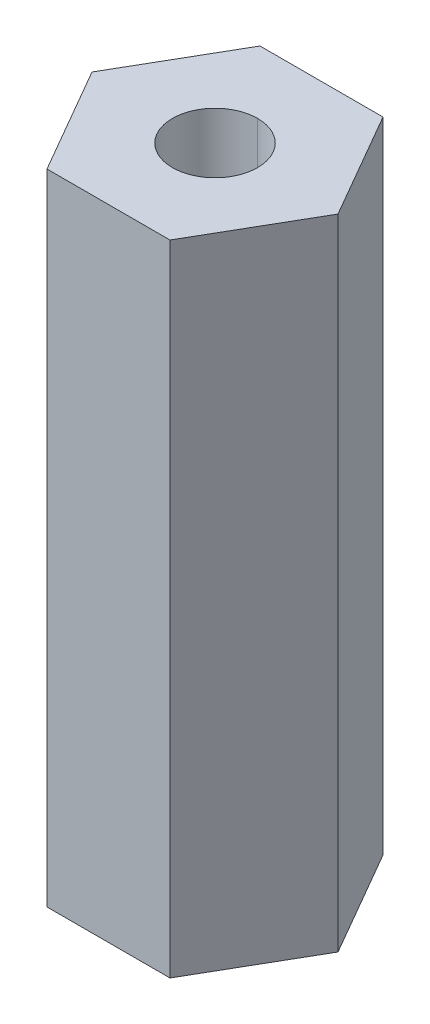
ISO-10303-21;
HEADER;
FILE_DESCRIPTION(('STEP AP214'),'2;1');
FILE_NAME('part.step','',(''),(''),'','','');
FILE_SCHEMA(('AUTOMOTIVE_DESIGN { 1 0 10303 214 1 1 1 1 }'));
ENDSEC;
DATA;
#1=APPLICATION_CONTEXT('core data for automotive mechanical design processes');
#2=APPLICATION_PROTOCOL_DEFINITION('international standard','automotive_design',2000,#1);
#3=PRODUCT_CONTEXT('',#1,'mechanical');
#4=PRODUCT('Part','Part','',(#3));
#5=PRODUCT_RELATED_PRODUCT_CATEGORY('part','',(#4));
#6=PRODUCT_DEFINITION_FORMATION('','',#4);
#7=PRODUCT_DEFINITION_CONTEXT('part definition',#1,'design');
#8=PRODUCT_DEFINITION('design','',#6,#7);
#9=PRODUCT_DEFINITION_SHAPE('','',#8);
#10=(LENGTH_UNIT() NAMED_UNIT(*) SI_UNIT(.MILLI.,.METRE.));
#11=(NAMED_UNIT(*) PLANE_ANGLE_UNIT() SI_UNIT($,.RADIAN.));
#12=(NAMED_UNIT(*) SI_UNIT($,.STERADIAN.) SOLID_ANGLE_UNIT());
#13=UNCERTAINTY_MEASURE_WITH_UNIT(LENGTH_MEASURE(1.E-05),#10,'distance_accuracy_value','');
#14=(GEOMETRIC_REPRESENTATION_CONTEXT(3) GLOBAL_UNCERTAINTY_ASSIGNED_CONTEXT((#13)) GLOBAL_UNIT_ASSIGNED_CONTEXT((#10,
#11,#12)) REPRESENTATION_CONTEXT('',''));
#15=CARTESIAN_POINT('',(0.,0.,0.));
#16=DIRECTION('',(0.,0.,1.));
#17=DIRECTION('',(1.,0.,0.));
#18=AXIS2_PLACEMENT_3D('',#15,#16,#17);
#19=CARTESIAN_POINT('',(0.,15.,1.));
#20=CARTESIAN_POINT('',(-1.,15.,1.));
#21=CARTESIAN_POINT('',(-1.,15.,0.));
#22=CARTESIAN_POINT('',(-1.,15.,-1.));
#23=CARTESIAN_POINT('',(0.,15.,-1.));
#24=CARTESIAN_POINT('',(0.,0.,1.));
#25=CARTESIAN_POINT('',(-1.,0.,1.));
#26=CARTESIAN_POINT('',(-1.,0.,0.));
#27=CARTESIAN_POINT('',(-1.,0.,-1.));
#28=CARTESIAN_POINT('',(0.,0.,-1.));
#29=(BOUNDED_SURFACE() B_SPLINE_SURFACE(1,2,((#19,#20,#21,#22,#23),(#24,#25,#26,#27,#28)),
.UNSPECIFIED.,.F.,.F.,.F.) B_SPLINE_SURFACE_WITH_KNOTS((2,2),(3,2,3),(-7.5,7.5),
(-3.14159265358979,-1.5707963267949,0.),
.UNSPECIFIED.) GEOMETRIC_REPRESENTATION_ITEM() RATIONAL_B_SPLINE_SURFACE(((1.,0.707106781186548,
1.,0.707106781186548,1.),(1.,0.707106781186548,1.,0.707106781186548,1.))) REPRESENTATION_ITEM('') SURFACE());
#30=CARTESIAN_POINT('',(0.,15.,-1.));
#31=CARTESIAN_POINT('',(0.,0.,-1.));
#32=(BOUNDED_CURVE() B_SPLINE_CURVE(1,(#30,#31),.UNSPECIFIED.,.F.,
.F.) B_SPLINE_CURVE_WITH_KNOTS((2,2),(-7.5,7.5),
.UNSPECIFIED.) CURVE() GEOMETRIC_REPRESENTATION_ITEM() RATIONAL_B_SPLINE_CURVE((1.,1.)) REPRESENTATION_ITEM(''));
#33=CARTESIAN_POINT('',(0.,15.,-1.));
#34=VERTEX_POINT('',#33);
#35=CARTESIAN_POINT('',(0.,0.,-1.));
#36=VERTEX_POINT('',#35);
#37=EDGE_CURVE('E174',#34,#36,#32,.T.);
#38=CARTESIAN_POINT('',(0.,15.,1.));
#39=CARTESIAN_POINT('',(-1.,15.,1.));
#40=CARTESIAN_POINT('',(-1.,15.,0.));
#41=CARTESIAN_POINT('',(-1.,15.,-1.));
#42=CARTESIAN_POINT('',(0.,15.,-1.));
#43=(BOUNDED_CURVE() B_SPLINE_CURVE(2,(#38,#39,#40,#41,#42),.UNSPECIFIED.,.F.,
.F.) B_SPLINE_CURVE_WITH_KNOTS((3,2,3),(0.,1.5707963267949,3.14159265358979),
.UNSPECIFIED.) CURVE() GEOMETRIC_REPRESENTATION_ITEM() RATIONAL_B_SPLINE_CURVE((1.,
0.707106781186548,1.,0.707106781186548,1.)) REPRESENTATION_ITEM(''));
#44=CARTESIAN_POINT('',(0.,15.,1.));
#45=VERTEX_POINT('',#44);
#46=EDGE_CURVE('E91',#45,#34,#43,.T.);
#47=CARTESIAN_POINT('',(0.,15.,1.));
#48=CARTESIAN_POINT('',(0.,0.,1.));
#49=(BOUNDED_CURVE() B_SPLINE_CURVE(1,(#47,#48),.UNSPECIFIED.,.F.,
.F.) B_SPLINE_CURVE_WITH_KNOTS((2,2),(-7.5,7.5),
.UNSPECIFIED.) CURVE() GEOMETRIC_REPRESENTATION_ITEM() RATIONAL_B_SPLINE_CURVE((1.,1.)) REPRESENTATION_ITEM(''));
#50=CARTESIAN_POINT('',(0.,0.,1.));
#51=VERTEX_POINT('',#50);
#52=EDGE_CURVE('E23',#45,#51,#49,.T.);
#53=CARTESIAN_POINT('',(0.,0.,1.));
#54=CARTESIAN_POINT('',(-1.,0.,1.));
#55=CARTESIAN_POINT('',(-1.,0.,0.));
#56=CARTESIAN_POINT('',(-1.,0.,-1.));
#57=CARTESIAN_POINT('',(0.,0.,-1.));
#58=(BOUNDED_CURVE() B_SPLINE_CURVE(2,(#53,#54,#55,#56,#57),.UNSPECIFIED.,.F.,
.F.) B_SPLINE_CURVE_WITH_KNOTS((3,2,3),(0.,1.5707963267949,3.14159265358979),
.UNSPECIFIED.) CURVE() GEOMETRIC_REPRESENTATION_ITEM() RATIONAL_B_SPLINE_CURVE((1.,
0.707106781186548,1.,0.707106781186548,1.)) REPRESENTATION_ITEM(''));
#59=EDGE_CURVE('E79',#51,#36,#58,.T.);
#60=ORIENTED_EDGE('',*,*,#37,.F.);
#61=ORIENTED_EDGE('',*,*,#46,.F.);
#62=ORIENTED_EDGE('',*,*,#52,.T.);
#63=ORIENTED_EDGE('',*,*,#59,.T.);
#64=EDGE_LOOP('',(#60,#61,#62,#63));
#65=FACE_BOUND('',#64,.T.);
#66=ADVANCED_FACE('F17',(#65),#29,.T.);
#67=CARTESIAN_POINT('',(1.43837567300093,-0.0099999999999989,2.50866025403838));
#68=CARTESIAN_POINT('',(1.43837567300093,15.01,2.50866025403838));
#69=CARTESIAN_POINT('',(2.89175134571016,-0.0099999999999989,-0.00866025420518224));
#70=CARTESIAN_POINT('',(2.89175134571016,15.01,-0.00866025420518224));
#71=(BOUNDED_SURFACE() B_SPLINE_SURFACE(1,1,((#67,#68),(#69,#70)),.UNSPECIFIED.,.F.,.F.,
.F.) B_SPLINE_SURFACE_WITH_KNOTS((2,2),(2,2),(-0.28967513459611,0.001),(-1.501,0.001),
.UNSPECIFIED.) GEOMETRIC_REPRESENTATION_ITEM() RATIONAL_B_SPLINE_SURFACE(((1.,1.),(1.,1.))) REPRESENTATION_ITEM('') SURFACE());
#72=CARTESIAN_POINT('',(1.443375673,0.,2.5));
#73=CARTESIAN_POINT('',(2.886751346,0.,0.));
#74=(BOUNDED_CURVE() B_SPLINE_CURVE(1,(#72,#73),.UNSPECIFIED.,.F.,
.F.) B_SPLINE_CURVE_WITH_KNOTS((2,2),(0.,1.),
.UNSPECIFIED.) CURVE() GEOMETRIC_REPRESENTATION_ITEM() RATIONAL_B_SPLINE_CURVE((1.,1.)) REPRESENTATION_ITEM(''));
#75=CARTESIAN_POINT('',(1.443375673,0.,2.5));
#76=VERTEX_POINT('',#75);
#77=CARTESIAN_POINT('',(2.886751346,0.,0.));
#78=VERTEX_POINT('',#77);
#79=EDGE_CURVE('E123',#76,#78,#74,.T.);
#80=CARTESIAN_POINT('',(2.886751346,15.,0.));
#81=CARTESIAN_POINT('',(2.886751346,0.,0.));
#82=(BOUNDED_CURVE() B_SPLINE_CURVE(1,(#80,#81),.UNSPECIFIED.,.F.,
.F.) B_SPLINE_CURVE_WITH_KNOTS((2,2),(0.,1.),
.UNSPECIFIED.) CURVE() GEOMETRIC_REPRESENTATION_ITEM() RATIONAL_B_SPLINE_CURVE((1.,1.)) REPRESENTATION_ITEM(''));
#83=CARTESIAN_POINT('',(2.886751346,15.,0.));
#84=VERTEX_POINT('',#83);
#85=EDGE_CURVE('E11',#84,#78,#82,.T.);
#86=CARTESIAN_POINT('',(1.443375673,15.,2.5));
#87=CARTESIAN_POINT('',(2.886751346,15.,0.));
#88=(BOUNDED_CURVE() B_SPLINE_CURVE(1,(#86,#87),.UNSPECIFIED.,.F.,
.F.) B_SPLINE_CURVE_WITH_KNOTS((2,2),(0.,1.),
.UNSPECIFIED.) CURVE() GEOMETRIC_REPRESENTATION_ITEM() RATIONAL_B_SPLINE_CURVE((1.,1.)) REPRESENTATION_ITEM(''));
#89=CARTESIAN_POINT('',(1.443375673,15.,2.5));
#90=VERTEX_POINT('',#89);
#91=EDGE_CURVE('E121',#90,#84,#88,.T.);
#92=CARTESIAN_POINT('',(1.443375673,15.,2.5));
#93=CARTESIAN_POINT('',(1.443375673,0.,2.5));
#94=(BOUNDED_CURVE() B_SPLINE_CURVE(1,(#92,#93),.UNSPECIFIED.,.F.,
.F.) B_SPLINE_CURVE_WITH_KNOTS((2,2),(0.,1.),
.UNSPECIFIED.) CURVE() GEOMETRIC_REPRESENTATION_ITEM() RATIONAL_B_SPLINE_CURVE((1.,1.)) REPRESENTATION_ITEM(''));
#95=EDGE_CURVE('E224',#90,#76,#94,.T.);
#96=ORIENTED_EDGE('',*,*,#79,.T.);
#97=ORIENTED_EDGE('',*,*,#85,.F.);
#98=ORIENTED_EDGE('',*,*,#91,.F.);
#99=ORIENTED_EDGE('',*,*,#95,.T.);
#100=EDGE_LOOP('',(#96,#97,#98,#99));
#101=FACE_BOUND('',#100,.T.);
#102=ADVANCED_FACE('F119',(#101),#71,.T.);
#103=CARTESIAN_POINT('',(2.89175134599907,-0.0099999999999989,0.00866025403838329));
#104=CARTESIAN_POINT('',(2.89175134599907,15.01,0.00866025403838344));
#105=CARTESIAN_POINT('',(1.43837567328984,-0.0099999999999989,-2.50866025420518));
#106=CARTESIAN_POINT('',(1.43837567328984,15.01,-2.50866025420518));
#107=(BOUNDED_SURFACE() B_SPLINE_SURFACE(1,1,((#103,#104),(#105,#106)),.UNSPECIFIED.,.F.,.F.,
.F.) B_SPLINE_SURFACE_WITH_KNOTS((2,2),(2,2),(-0.28967513459611,0.001),(-1.501,0.001),
.UNSPECIFIED.) GEOMETRIC_REPRESENTATION_ITEM() RATIONAL_B_SPLINE_SURFACE(((1.,1.),(1.,1.))) REPRESENTATION_ITEM('') SURFACE());
#108=CARTESIAN_POINT('',(2.886751346,0.,0.));
#109=CARTESIAN_POINT('',(1.443375673,0.,-2.5));
#110=(BOUNDED_CURVE() B_SPLINE_CURVE(1,(#108,#109),.UNSPECIFIED.,.F.,
.F.) B_SPLINE_CURVE_WITH_KNOTS((2,2),(0.,1.),
.UNSPECIFIED.) CURVE() GEOMETRIC_REPRESENTATION_ITEM() RATIONAL_B_SPLINE_CURVE((1.,1.)) REPRESENTATION_ITEM(''));
#111=CARTESIAN_POINT('',(1.443375673,0.,-2.5));
#112=VERTEX_POINT('',#111);
#113=EDGE_CURVE('E146',#78,#112,#110,.T.);
#114=CARTESIAN_POINT('',(1.443375673,15.,-2.5));
#115=CARTESIAN_POINT('',(1.443375673,0.,-2.5));
#116=(BOUNDED_CURVE() B_SPLINE_CURVE(1,(#114,#115),.UNSPECIFIED.,.F.,
.F.) B_SPLINE_CURVE_WITH_KNOTS((2,2),(0.,1.),
.UNSPECIFIED.) CURVE() GEOMETRIC_REPRESENTATION_ITEM() RATIONAL_B_SPLINE_CURVE((1.,1.)) REPRESENTATION_ITEM(''));
#117=CARTESIAN_POINT('',(1.443375673,15.,-2.5));
#118=VERTEX_POINT('',#117);
#119=EDGE_CURVE('E32',#118,#112,#116,.T.);
#120=CARTESIAN_POINT('',(2.886751346,15.,0.));
#121=CARTESIAN_POINT('',(1.443375673,15.,-2.5));
#122=(BOUNDED_CURVE() B_SPLINE_CURVE(1,(#120,#121),.UNSPECIFIED.,.F.,
.F.) B_SPLINE_CURVE_WITH_KNOTS((2,2),(0.,1.),
.UNSPECIFIED.) CURVE() GEOMETRIC_REPRESENTATION_ITEM() RATIONAL_B_SPLINE_CURVE((1.,1.)) REPRESENTATION_ITEM(''));
#123=EDGE_CURVE('E128',#84,#118,#122,.T.);
#124=ORIENTED_EDGE('',*,*,#113,.T.);
#125=ORIENTED_EDGE('',*,*,#119,.F.);
#126=ORIENTED_EDGE('',*,*,#123,.F.);
#127=ORIENTED_EDGE('',*,*,#85,.T.);
#128=EDGE_LOOP('',(#124,#125,#126,#127));
#129=FACE_BOUND('',#128,.T.);
#130=ADVANCED_FACE('F129',(#129),#107,.T.);
#131=CARTESIAN_POINT('',(1.453375673,-0.0099999999999989,-2.5));
#132=CARTESIAN_POINT('',(1.453375673,15.01,-2.5));
#133=CARTESIAN_POINT('',(-1.453375673,-0.0099999999999989,-2.5));
#134=CARTESIAN_POINT('',(-1.453375673,15.01,-2.5));
#135=(BOUNDED_SURFACE() B_SPLINE_SURFACE(1,1,((#131,#132),(#133,#134)),.UNSPECIFIED.,.F.,.F.,
.F.) B_SPLINE_SURFACE_WITH_KNOTS((2,2),(2,2),(-0.2896751346,0.001),(-1.501,0.001),
.UNSPECIFIED.) GEOMETRIC_REPRESENTATION_ITEM() RATIONAL_B_SPLINE_SURFACE(((1.,1.),(1.,1.))) REPRESENTATION_ITEM('') SURFACE());
#136=CARTESIAN_POINT('',(1.443375673,0.,-2.5));
#137=CARTESIAN_POINT('',(-1.443375673,0.,-2.5));
#138=(BOUNDED_CURVE() B_SPLINE_CURVE(1,(#136,#137),.UNSPECIFIED.,.F.,
.F.) B_SPLINE_CURVE_WITH_KNOTS((2,2),(0.,1.),
.UNSPECIFIED.) CURVE() GEOMETRIC_REPRESENTATION_ITEM() RATIONAL_B_SPLINE_CURVE((1.,1.)) REPRESENTATION_ITEM(''));
#139=CARTESIAN_POINT('',(-1.443375673,0.,-2.5));
#140=VERTEX_POINT('',#139);
#141=EDGE_CURVE('E252',#112,#140,#138,.T.);
#142=CARTESIAN_POINT('',(-1.443375673,15.,-2.5));
#143=CARTESIAN_POINT('',(-1.443375673,0.,-2.5));
#144=(BOUNDED_CURVE() B_SPLINE_CURVE(1,(#142,#143),.UNSPECIFIED.,.F.,
.F.) B_SPLINE_CURVE_WITH_KNOTS((2,2),(0.,1.),
.UNSPECIFIED.) CURVE() GEOMETRIC_REPRESENTATION_ITEM() RATIONAL_B_SPLINE_CURVE((1.,1.)) REPRESENTATION_ITEM(''));
#145=CARTESIAN_POINT('',(-1.443375673,15.,-2.5));
#146=VERTEX_POINT('',#145);
#147=EDGE_CURVE('E238',#146,#140,#144,.T.);
#148=CARTESIAN_POINT('',(1.443375673,15.,-2.5));
#149=CARTESIAN_POINT('',(-1.443375673,15.,-2.5));
#150=(BOUNDED_CURVE() B_SPLINE_CURVE(1,(#148,#149),.UNSPECIFIED.,.F.,
.F.) B_SPLINE_CURVE_WITH_KNOTS((2,2),(0.,1.),
.UNSPECIFIED.) CURVE() GEOMETRIC_REPRESENTATION_ITEM() RATIONAL_B_SPLINE_CURVE((1.,1.)) REPRESENTATION_ITEM(''));
#151=EDGE_CURVE('E134',#118,#146,#150,.T.);
#152=ORIENTED_EDGE('',*,*,#141,.T.);
#153=ORIENTED_EDGE('',*,*,#147,.F.);
#154=ORIENTED_EDGE('',*,*,#151,.F.);
#155=ORIENTED_EDGE('',*,*,#119,.T.);
#156=EDGE_LOOP('',(#152,#153,#154,#155));
#157=FACE_BOUND('',#156,.T.);
#158=ADVANCED_FACE('F307',(#157),#135,.T.);
#159=CARTESIAN_POINT('',(-1.43837567300093,-0.0099999999999989,-2.50866025403838));
#160=CARTESIAN_POINT('',(-1.43837567300093,15.01,-2.50866025403838));
#161=CARTESIAN_POINT('',(-2.89175134571016,-0.0099999999999989,0.00866025420518224));
#162=CARTESIAN_POINT('',(-2.89175134571016,15.01,0.00866025420518224));
#163=(BOUNDED_SURFACE() B_SPLINE_SURFACE(1,1,((#159,#160),(#161,#162)),.UNSPECIFIED.,.F.,.F.,
.F.) B_SPLINE_SURFACE_WITH_KNOTS((2,2),(2,2),(-0.28967513459611,0.001),(-1.501,0.001),
.UNSPECIFIED.) GEOMETRIC_REPRESENTATION_ITEM() RATIONAL_B_SPLINE_SURFACE(((1.,1.),(1.,1.))) REPRESENTATION_ITEM('') SURFACE());
#164=CARTESIAN_POINT('',(-1.443375673,0.,-2.5));
#165=CARTESIAN_POINT('',(-2.886751346,0.,0.));
#166=(BOUNDED_CURVE() B_SPLINE_CURVE(1,(#164,#165),.UNSPECIFIED.,.F.,
.F.) B_SPLINE_CURVE_WITH_KNOTS((2,2),(0.,1.),
.UNSPECIFIED.) CURVE() GEOMETRIC_REPRESENTATION_ITEM() RATIONAL_B_SPLINE_CURVE((1.,1.)) REPRESENTATION_ITEM(''));
#167=CARTESIAN_POINT('',(-2.886751346,0.,0.));
#168=VERTEX_POINT('',#167);
#169=EDGE_CURVE('E163',#140,#168,#166,.T.);
#170=CARTESIAN_POINT('',(-2.886751346,15.,0.));
#171=CARTESIAN_POINT('',(-2.886751346,0.,0.));
#172=(BOUNDED_CURVE() B_SPLINE_CURVE(1,(#170,#171),.UNSPECIFIED.,.F.,
.F.) B_SPLINE_CURVE_WITH_KNOTS((2,2),(0.,1.),
.UNSPECIFIED.) CURVE() GEOMETRIC_REPRESENTATION_ITEM() RATIONAL_B_SPLINE_CURVE((1.,1.)) REPRESENTATION_ITEM(''));
#173=CARTESIAN_POINT('',(-2.886751346,15.,0.));
#174=VERTEX_POINT('',#173);
#175=EDGE_CURVE('E231',#174,#168,#172,.T.);
#176=CARTESIAN_POINT('',(-1.443375673,15.,-2.5));
#177=CARTESIAN_POINT('',(-2.886751346,15.,0.));
#178=(BOUNDED_CURVE() B_SPLINE_CURVE(1,(#176,#177),.UNSPECIFIED.,.F.,
.F.) B_SPLINE_CURVE_WITH_KNOTS((2,2),(0.,1.),
.UNSPECIFIED.) CURVE() GEOMETRIC_REPRESENTATION_ITEM() RATIONAL_B_SPLINE_CURVE((1.,1.)) REPRESENTATION_ITEM(''));
#179=EDGE_CURVE('E152',#146,#174,#178,.T.);
#180=ORIENTED_EDGE('',*,*,#169,.T.);
#181=ORIENTED_EDGE('',*,*,#175,.F.);
#182=ORIENTED_EDGE('',*,*,#179,.F.);
#183=ORIENTED_EDGE('',*,*,#147,.T.);
#184=EDGE_LOOP('',(#180,#181,#182,#183));
#185=FACE_BOUND('',#184,.T.);
#186=ADVANCED_FACE('F302',(#185),#163,.T.);
#187=CARTESIAN_POINT('',(-2.89175134599907,-0.0099999999999989,-0.00866025403838329));
#188=CARTESIAN_POINT('',(-2.89175134599907,15.01,-0.00866025403838344));
#189=CARTESIAN_POINT('',(-1.43837567328984,-0.0099999999999989,2.50866025420518));
#190=CARTESIAN_POINT('',(-1.43837567328984,15.01,2.50866025420518));
#191=(BOUNDED_SURFACE() B_SPLINE_SURFACE(1,1,((#187,#188),(#189,#190)),.UNSPECIFIED.,.F.,.F.,
.F.) B_SPLINE_SURFACE_WITH_KNOTS((2,2),(2,2),(-0.28967513459611,0.001),(-1.501,0.001),
.UNSPECIFIED.) GEOMETRIC_REPRESENTATION_ITEM() RATIONAL_B_SPLINE_SURFACE(((1.,1.),(1.,1.))) REPRESENTATION_ITEM('') SURFACE());
#192=CARTESIAN_POINT('',(-2.886751346,0.,0.));
#193=CARTESIAN_POINT('',(-1.443375673,0.,2.5));
#194=(BOUNDED_CURVE() B_SPLINE_CURVE(1,(#192,#193),.UNSPECIFIED.,.F.,
.F.) B_SPLINE_CURVE_WITH_KNOTS((2,2),(0.,1.),
.UNSPECIFIED.) CURVE() GEOMETRIC_REPRESENTATION_ITEM() RATIONAL_B_SPLINE_CURVE((1.,1.)) REPRESENTATION_ITEM(''));
#195=CARTESIAN_POINT('',(-1.443375673,0.,2.5));
#196=VERTEX_POINT('',#195);
#197=EDGE_CURVE('E156',#168,#196,#194,.T.);
#198=CARTESIAN_POINT('',(-1.443375673,15.,2.5));
#199=CARTESIAN_POINT('',(-1.443375673,0.,2.5));
#200=(BOUNDED_CURVE() B_SPLINE_CURVE(1,(#198,#199),.UNSPECIFIED.,.F.,
.F.) B_SPLINE_CURVE_WITH_KNOTS((2,2),(0.,1.),
.UNSPECIFIED.) CURVE() GEOMETRIC_REPRESENTATION_ITEM() RATIONAL_B_SPLINE_CURVE((1.,1.)) REPRESENTATION_ITEM(''));
#201=CARTESIAN_POINT('',(-1.443375673,15.,2.5));
#202=VERTEX_POINT('',#201);
#203=EDGE_CURVE('E47',#202,#196,#200,.T.);
#204=CARTESIAN_POINT('',(-2.886751346,15.,0.));
#205=CARTESIAN_POINT('',(-1.443375673,15.,2.5));
#206=(BOUNDED_CURVE() B_SPLINE_CURVE(1,(#204,#205),.UNSPECIFIED.,.F.,
.F.) B_SPLINE_CURVE_WITH_KNOTS((2,2),(0.,1.),
.UNSPECIFIED.) CURVE() GEOMETRIC_REPRESENTATION_ITEM() RATIONAL_B_SPLINE_CURVE((1.,1.)) REPRESENTATION_ITEM(''));
#207=EDGE_CURVE('E182',#174,#202,#206,.T.);
#208=ORIENTED_EDGE('',*,*,#197,.T.);
#209=ORIENTED_EDGE('',*,*,#203,.F.);
#210=ORIENTED_EDGE('',*,*,#207,.F.);
#211=ORIENTED_EDGE('',*,*,#175,.T.);
#212=EDGE_LOOP('',(#208,#209,#210,#211));
#213=FACE_BOUND('',#212,.T.);
#214=ADVANCED_FACE('F312',(#213),#191,.T.);
#215=CARTESIAN_POINT('',(-1.453375673,-0.0099999999999989,2.5));
#216=CARTESIAN_POINT('',(-1.453375673,15.01,2.5));
#217=CARTESIAN_POINT('',(1.453375673,-0.0099999999999989,2.5));
#218=CARTESIAN_POINT('',(1.453375673,15.01,2.5));
#219=(BOUNDED_SURFACE() B_SPLINE_SURFACE(1,1,((#215,#216),(#217,#218)),.UNSPECIFIED.,.F.,.F.,
.F.) B_SPLINE_SURFACE_WITH_KNOTS((2,2),(2,2),(-0.2896751346,0.001),(-1.501,0.001),
.UNSPECIFIED.) GEOMETRIC_REPRESENTATION_ITEM() RATIONAL_B_SPLINE_SURFACE(((1.,1.),(1.,1.))) REPRESENTATION_ITEM('') SURFACE());
#220=CARTESIAN_POINT('',(-1.443375673,0.,2.5));
#221=CARTESIAN_POINT('',(1.443375673,0.,2.5));
#222=(BOUNDED_CURVE() B_SPLINE_CURVE(1,(#220,#221),.UNSPECIFIED.,.F.,
.F.) B_SPLINE_CURVE_WITH_KNOTS((2,2),(0.,1.),
.UNSPECIFIED.) CURVE() GEOMETRIC_REPRESENTATION_ITEM() RATIONAL_B_SPLINE_CURVE((1.,1.)) REPRESENTATION_ITEM(''));
#223=EDGE_CURVE('E164',#196,#76,#222,.T.);
#224=CARTESIAN_POINT('',(-1.443375673,15.,2.5));
#225=CARTESIAN_POINT('',(1.443375673,15.,2.5));
#226=(BOUNDED_CURVE() B_SPLINE_CURVE(1,(#224,#225),.UNSPECIFIED.,.F.,
.F.) B_SPLINE_CURVE_WITH_KNOTS((2,2),(0.,1.),
.UNSPECIFIED.) CURVE() GEOMETRIC_REPRESENTATION_ITEM() RATIONAL_B_SPLINE_CURVE((1.,1.)) REPRESENTATION_ITEM(''));
#227=EDGE_CURVE('E138',#202,#90,#226,.T.);
#228=ORIENTED_EDGE('',*,*,#223,.T.);
#229=ORIENTED_EDGE('',*,*,#95,.F.);
#230=ORIENTED_EDGE('',*,*,#227,.F.);
#231=ORIENTED_EDGE('',*,*,#203,.T.);
#232=EDGE_LOOP('',(#228,#229,#230,#231));
#233=FACE_BOUND('',#232,.T.);
#234=ADVANCED_FACE('F343',(#233),#219,.T.);
#235=CARTESIAN_POINT('',(-2.896751346,15.,-2.51));
#236=CARTESIAN_POINT('',(2.896751346,15.,-2.51));
#237=CARTESIAN_POINT('',(-2.896751346,15.,2.51));
#238=CARTESIAN_POINT('',(2.896751346,15.,2.51));
#239=(BOUNDED_SURFACE() B_SPLINE_SURFACE(1,1,((#235,#236),(#237,#238)),.UNSPECIFIED.,.F.,.F.,
.F.) B_SPLINE_SURFACE_WITH_KNOTS((2,2),(2,2),(-0.251,0.251),(-0.2896751346,0.2896751346),
.UNSPECIFIED.) GEOMETRIC_REPRESENTATION_ITEM() RATIONAL_B_SPLINE_SURFACE(((1.,1.),(1.,1.))) REPRESENTATION_ITEM('') SURFACE());
#240=CARTESIAN_POINT('',(0.,15.,-1.));
#241=CARTESIAN_POINT('',(1.,15.,-1.));
#242=CARTESIAN_POINT('',(1.,15.,0.));
#243=CARTESIAN_POINT('',(1.,15.,1.));
#244=CARTESIAN_POINT('',(0.,15.,1.));
#245=(BOUNDED_CURVE() B_SPLINE_CURVE(2,(#240,#241,#242,#243,#244),.UNSPECIFIED.,.F.,
.F.) B_SPLINE_CURVE_WITH_KNOTS((3,2,3),(-3.14159265358979,-1.5707963267949,0.),
.UNSPECIFIED.) CURVE() GEOMETRIC_REPRESENTATION_ITEM() RATIONAL_B_SPLINE_CURVE((1.,
0.707106781186548,1.,0.707106781186548,1.)) REPRESENTATION_ITEM(''));
#246=EDGE_CURVE('E165',#34,#45,#245,.T.);
#247=ORIENTED_EDGE('',*,*,#246,.T.);
#248=ORIENTED_EDGE('',*,*,#46,.T.);
#249=EDGE_LOOP('',(#247,#248));
#250=FACE_BOUND('',#249,.T.);
#251=ORIENTED_EDGE('',*,*,#91,.T.);
#252=ORIENTED_EDGE('',*,*,#123,.T.);
#253=ORIENTED_EDGE('',*,*,#151,.T.);
#254=ORIENTED_EDGE('',*,*,#179,.T.);
#255=ORIENTED_EDGE('',*,*,#207,.T.);
#256=ORIENTED_EDGE('',*,*,#227,.T.);
#257=EDGE_LOOP('',(#251,#252,#253,#254,#255,#256));
#258=FACE_BOUND('',#257,.T.);
#259=ADVANCED_FACE('F136',(#250,#258),#239,.T.);
#260=CARTESIAN_POINT('',(-2.896751346,0.,2.51));
#261=CARTESIAN_POINT('',(2.896751346,0.,2.51));
#262=CARTESIAN_POINT('',(-2.896751346,0.,-2.51));
#263=CARTESIAN_POINT('',(2.896751346,0.,-2.51));
#264=(BOUNDED_SURFACE() B_SPLINE_SURFACE(1,1,((#260,#261),(#262,#263)),.UNSPECIFIED.,.F.,.F.,
.F.) B_SPLINE_SURFACE_WITH_KNOTS((2,2),(2,2),(-0.251,0.251),(-0.2896751346,0.2896751346),
.UNSPECIFIED.) GEOMETRIC_REPRESENTATION_ITEM() RATIONAL_B_SPLINE_SURFACE(((1.,1.),(1.,1.))) REPRESENTATION_ITEM('') SURFACE());
#265=CARTESIAN_POINT('',(0.,0.,-1.));
#266=CARTESIAN_POINT('',(1.,0.,-1.));
#267=CARTESIAN_POINT('',(1.,0.,0.));
#268=CARTESIAN_POINT('',(1.,0.,1.));
#269=CARTESIAN_POINT('',(0.,0.,1.));
#270=(BOUNDED_CURVE() B_SPLINE_CURVE(2,(#265,#266,#267,#268,#269),.UNSPECIFIED.,.F.,
.F.) B_SPLINE_CURVE_WITH_KNOTS((3,2,3),(-3.14159265358979,-1.5707963267949,0.),
.UNSPECIFIED.) CURVE() GEOMETRIC_REPRESENTATION_ITEM() RATIONAL_B_SPLINE_CURVE((1.,
0.707106781186548,1.,0.707106781186548,1.)) REPRESENTATION_ITEM(''));
#271=EDGE_CURVE('E190',#36,#51,#270,.T.);
#272=ORIENTED_EDGE('',*,*,#271,.F.);
#273=ORIENTED_EDGE('',*,*,#59,.F.);
#274=EDGE_LOOP('',(#272,#273));
#275=FACE_BOUND('',#274,.T.);
#276=ORIENTED_EDGE('',*,*,#79,.F.);
#277=ORIENTED_EDGE('',*,*,#223,.F.);
#278=ORIENTED_EDGE('',*,*,#197,.F.);
#279=ORIENTED_EDGE('',*,*,#169,.F.);
#280=ORIENTED_EDGE('',*,*,#141,.F.);
#281=ORIENTED_EDGE('',*,*,#113,.F.);
#282=EDGE_LOOP('',(#276,#277,#278,#279,#280,#281));
#283=FACE_BOUND('',#282,.T.);
#284=ADVANCED_FACE('F311',(#275,#283),#264,.T.);
#285=CARTESIAN_POINT('',(0.,15.,-1.));
#286=CARTESIAN_POINT('',(1.,15.,-1.));
#287=CARTESIAN_POINT('',(1.,15.,0.));
#288=CARTESIAN_POINT('',(1.,15.,1.));
#289=CARTESIAN_POINT('',(0.,15.,1.));
#290=CARTESIAN_POINT('',(0.,0.,-1.));
#291=CARTESIAN_POINT('',(1.,0.,-1.));
#292=CARTESIAN_POINT('',(1.,0.,0.));
#293=CARTESIAN_POINT('',(1.,0.,1.));
#294=CARTESIAN_POINT('',(0.,0.,1.));
#295=(BOUNDED_SURFACE() B_SPLINE_SURFACE(1,2,((#285,#286,#287,#288,#289),(#290,#291,#292,#293,
#294)),.UNSPECIFIED.,.F.,.F.,.F.) B_SPLINE_SURFACE_WITH_KNOTS((2,2),(3,2,3),(-7.5,7.5),(0.,
1.5707963267949,3.14159265358979),
.UNSPECIFIED.) GEOMETRIC_REPRESENTATION_ITEM() RATIONAL_B_SPLINE_SURFACE(((1.,0.707106781186548,
1.,0.707106781186548,1.),(1.,0.707106781186548,1.,0.707106781186548,1.))) REPRESENTATION_ITEM('') SURFACE());
#296=ORIENTED_EDGE('',*,*,#246,.F.);
#297=ORIENTED_EDGE('',*,*,#37,.T.);
#298=ORIENTED_EDGE('',*,*,#271,.T.);
#299=ORIENTED_EDGE('',*,*,#52,.F.);
#300=EDGE_LOOP('',(#296,#297,#298,#299));
#301=FACE_BOUND('',#300,.T.);
#302=ADVANCED_FACE('F19',(#301),#295,.T.);
#303=CLOSED_SHELL('',(#66,#102,#130,#158,#186,#214,#234,#259,#284,#302));
#304=MANIFOLD_SOLID_BREP('B1',#303);
#305=ADVANCED_BREP_SHAPE_REPRESENTATION('',(#18,#304),#14);
#306=SHAPE_DEFINITION_REPRESENTATION(#9,#305);
ENDSEC;
END-ISO-10303-21;
